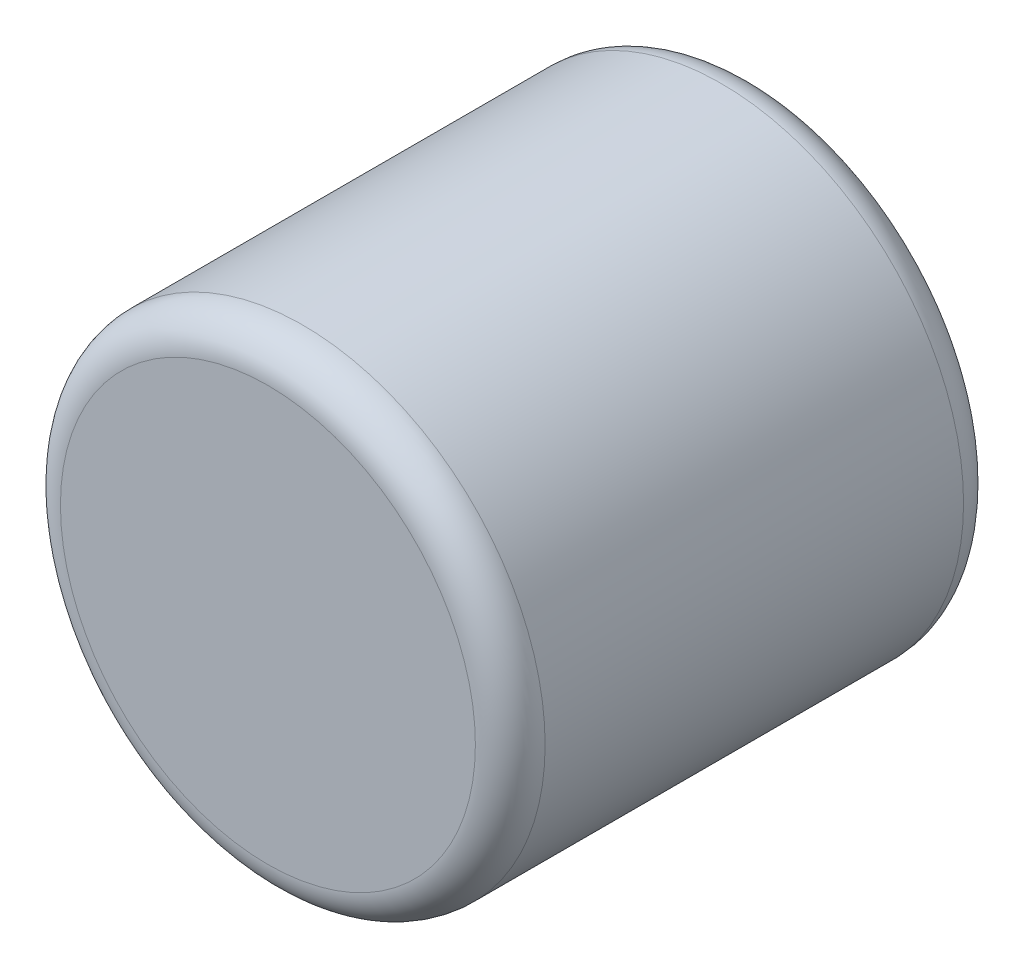
ISO-10303-21;
HEADER;
FILE_DESCRIPTION(('STEP AP214'),'2;1');
FILE_NAME('part.step','',(''),(''),'','','');
FILE_SCHEMA(('AUTOMOTIVE_DESIGN { 1 0 10303 214 1 1 1 1 }'));
ENDSEC;
DATA;
#1=APPLICATION_CONTEXT('core data for automotive mechanical design processes');
#2=APPLICATION_PROTOCOL_DEFINITION('international standard','automotive_design',2000,#1);
#3=PRODUCT_CONTEXT('',#1,'mechanical');
#4=PRODUCT('Part','Part','',(#3));
#5=PRODUCT_RELATED_PRODUCT_CATEGORY('part','',(#4));
#6=PRODUCT_DEFINITION_FORMATION('','',#4);
#7=PRODUCT_DEFINITION_CONTEXT('part definition',#1,'design');
#8=PRODUCT_DEFINITION('design','',#6,#7);
#9=PRODUCT_DEFINITION_SHAPE('','',#8);
#10=(LENGTH_UNIT() NAMED_UNIT(*) SI_UNIT(.MILLI.,.METRE.));
#11=(NAMED_UNIT(*) PLANE_ANGLE_UNIT() SI_UNIT($,.RADIAN.));
#12=(NAMED_UNIT(*) SI_UNIT($,.STERADIAN.) SOLID_ANGLE_UNIT());
#13=UNCERTAINTY_MEASURE_WITH_UNIT(LENGTH_MEASURE(1.E-05),#10,'distance_accuracy_value','');
#14=(GEOMETRIC_REPRESENTATION_CONTEXT(3) GLOBAL_UNCERTAINTY_ASSIGNED_CONTEXT((#13)) GLOBAL_UNIT_ASSIGNED_CONTEXT((#10,
#11,#12)) REPRESENTATION_CONTEXT('',''));
#15=CARTESIAN_POINT('',(0.,0.,0.));
#16=DIRECTION('',(0.,0.,1.));
#17=DIRECTION('',(1.,0.,0.));
#18=AXIS2_PLACEMENT_3D('',#15,#16,#17);
#19=CARTESIAN_POINT('',(0.,0.,-7.));
#20=DIRECTION('',(0.,0.,1.));
#21=DIRECTION('',(1.,0.,0.));
#22=AXIS2_PLACEMENT_3D('',#19,#20,#21);
#23=CYLINDRICAL_SURFACE('',#22,3.475);
#24=CARTESIAN_POINT('',(0.,0.,-6.5));
#25=DIRECTION('',(0.,0.,1.));
#26=DIRECTION('',(1.,0.,0.));
#27=AXIS2_PLACEMENT_3D('',#24,#25,#26);
#28=CIRCLE('',#27,3.475);
#29=CARTESIAN_POINT('',(3.475,0.,-6.5));
#30=VERTEX_POINT('',#29);
#31=EDGE_CURVE('E31',#30,#30,#28,.T.);
#32=ORIENTED_EDGE('',*,*,#31,.T.);
#33=EDGE_LOOP('',(#32));
#34=FACE_BOUND('',#33,.T.);
#35=CARTESIAN_POINT('',(0.,0.,-0.5));
#36=DIRECTION('',(0.,0.,1.));
#37=DIRECTION('',(1.,0.,0.));
#38=AXIS2_PLACEMENT_3D('',#35,#36,#37);
#39=CIRCLE('',#38,3.475);
#40=CARTESIAN_POINT('',(3.475,0.,-0.5));
#41=VERTEX_POINT('',#40);
#42=EDGE_CURVE('E38',#41,#41,#39,.F.);
#43=ORIENTED_EDGE('',*,*,#42,.T.);
#44=EDGE_LOOP('',(#43));
#45=FACE_BOUND('',#44,.T.);
#46=ADVANCED_FACE('F15',(#34,#45),#23,.T.);
#47=CARTESIAN_POINT('',(0.,0.,-7.));
#48=DIRECTION('',(0.,0.,1.));
#49=DIRECTION('',(1.,0.,0.));
#50=AXIS2_PLACEMENT_3D('',#47,#48,#49);
#51=PLANE('',#50);
#52=CARTESIAN_POINT('',(0.,0.,-7.));
#53=DIRECTION('',(0.,0.,1.));
#54=DIRECTION('',(1.,0.,0.));
#55=AXIS2_PLACEMENT_3D('',#52,#53,#54);
#56=CIRCLE('',#55,2.975);
#57=CARTESIAN_POINT('',(2.975,0.,-7.));
#58=VERTEX_POINT('',#57);
#59=EDGE_CURVE('E23',#58,#58,#56,.F.);
#60=ORIENTED_EDGE('',*,*,#59,.T.);
#61=EDGE_LOOP('',(#60));
#62=FACE_BOUND('',#61,.T.);
#63=ADVANCED_FACE('F56',(#62),#51,.F.);
#64=CARTESIAN_POINT('',(0.,0.,0.));
#65=DIRECTION('',(0.,0.,1.));
#66=DIRECTION('',(1.,0.,0.));
#67=AXIS2_PLACEMENT_3D('',#64,#65,#66);
#68=PLANE('',#67);
#69=CARTESIAN_POINT('',(0.,0.,0.));
#70=DIRECTION('',(0.,0.,1.));
#71=DIRECTION('',(1.,0.,0.));
#72=AXIS2_PLACEMENT_3D('',#69,#70,#71);
#73=CIRCLE('',#72,2.975);
#74=CARTESIAN_POINT('',(2.975,0.,0.));
#75=VERTEX_POINT('',#74);
#76=EDGE_CURVE('E10',#75,#75,#73,.T.);
#77=ORIENTED_EDGE('',*,*,#76,.T.);
#78=EDGE_LOOP('',(#77));
#79=FACE_BOUND('',#78,.T.);
#80=ADVANCED_FACE('F53',(#79),#68,.T.);
#81=CARTESIAN_POINT('',(0.,0.,-6.5));
#82=DIRECTION('',(0.,0.,1.));
#83=DIRECTION('',(1.,0.,0.));
#84=AXIS2_PLACEMENT_3D('',#81,#82,#83);
#85=TOROIDAL_SURFACE('',#84,2.975,0.5);
#86=ORIENTED_EDGE('',*,*,#59,.F.);
#87=EDGE_LOOP('',(#86));
#88=FACE_BOUND('',#87,.T.);
#89=ORIENTED_EDGE('',*,*,#31,.F.);
#90=EDGE_LOOP('',(#89));
#91=FACE_BOUND('',#90,.T.);
#92=ADVANCED_FACE('F48',(#88,#91),#85,.T.);
#93=CARTESIAN_POINT('',(0.,0.,-0.5));
#94=DIRECTION('',(0.,0.,1.));
#95=DIRECTION('',(1.,0.,0.));
#96=AXIS2_PLACEMENT_3D('',#93,#94,#95);
#97=TOROIDAL_SURFACE('',#96,2.975,0.5);
#98=ORIENTED_EDGE('',*,*,#42,.F.);
#99=EDGE_LOOP('',(#98));
#100=FACE_BOUND('',#99,.T.);
#101=ORIENTED_EDGE('',*,*,#76,.F.);
#102=EDGE_LOOP('',(#101));
#103=FACE_BOUND('',#102,.T.);
#104=ADVANCED_FACE('F17',(#100,#103),#97,.T.);
#105=CLOSED_SHELL('',(#46,#63,#80,#92,#104));
#106=MANIFOLD_SOLID_BREP('B1',#105);
#107=ADVANCED_BREP_SHAPE_REPRESENTATION('',(#18,#106),#14);
#108=SHAPE_DEFINITION_REPRESENTATION(#9,#107);
ENDSEC;
END-ISO-10303-21;
